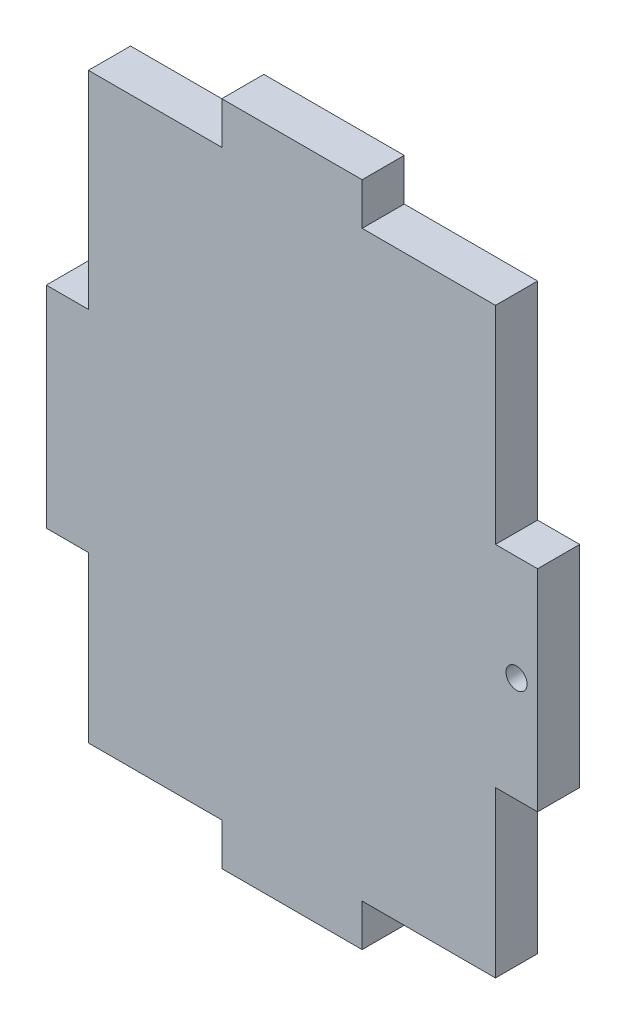
ISO-10303-21;
HEADER;
FILE_DESCRIPTION(('STEP AP214'),'2;1');
FILE_NAME('part.step','',(''),(''),'','','');
FILE_SCHEMA(('AUTOMOTIVE_DESIGN { 1 0 10303 214 1 1 1 1 }'));
ENDSEC;
DATA;
#1=APPLICATION_CONTEXT('core data for automotive mechanical design processes');
#2=APPLICATION_PROTOCOL_DEFINITION('international standard','automotive_design',2000,#1);
#3=PRODUCT_CONTEXT('',#1,'mechanical');
#4=PRODUCT('Part','Part','',(#3));
#5=PRODUCT_RELATED_PRODUCT_CATEGORY('part','',(#4));
#6=PRODUCT_DEFINITION_FORMATION('','',#4);
#7=PRODUCT_DEFINITION_CONTEXT('part definition',#1,'design');
#8=PRODUCT_DEFINITION('design','',#6,#7);
#9=PRODUCT_DEFINITION_SHAPE('','',#8);
#10=(LENGTH_UNIT() NAMED_UNIT(*) SI_UNIT(.MILLI.,.METRE.));
#11=(NAMED_UNIT(*) PLANE_ANGLE_UNIT() SI_UNIT($,.RADIAN.));
#12=(NAMED_UNIT(*) SI_UNIT($,.STERADIAN.) SOLID_ANGLE_UNIT());
#13=UNCERTAINTY_MEASURE_WITH_UNIT(LENGTH_MEASURE(1.E-05),#10,'distance_accuracy_value','');
#14=(GEOMETRIC_REPRESENTATION_CONTEXT(3) GLOBAL_UNCERTAINTY_ASSIGNED_CONTEXT((#13)) GLOBAL_UNIT_ASSIGNED_CONTEXT((#10,
#11,#12)) REPRESENTATION_CONTEXT('',''));
#15=CARTESIAN_POINT('',(0.,0.,0.));
#16=DIRECTION('',(0.,0.,1.));
#17=DIRECTION('',(1.,0.,0.));
#18=AXIS2_PLACEMENT_3D('',#15,#16,#17);
#19=CARTESIAN_POINT('',(-3.,44.5,6.));
#20=DIRECTION('',(0.,0.,-1.));
#21=DIRECTION('',(-1.,0.,0.));
#22=AXIS2_PLACEMENT_3D('',#19,#20,#21);
#23=CYLINDRICAL_SURFACE('',#22,1.5);
#24=CARTESIAN_POINT('',(-3.,44.5,6.));
#25=DIRECTION('',(0.,0.,-1.));
#26=DIRECTION('',(-1.,0.,0.));
#27=AXIS2_PLACEMENT_3D('',#24,#25,#26);
#28=CIRCLE('',#27,1.5);
#29=CARTESIAN_POINT('',(-4.5,44.5,6.));
#30=VERTEX_POINT('',#29);
#31=EDGE_CURVE('E343',#30,#30,#28,.T.);
#32=ORIENTED_EDGE('',*,*,#31,.F.);
#33=EDGE_LOOP('',(#32));
#34=FACE_BOUND('',#33,.T.);
#35=CARTESIAN_POINT('',(-3.,44.5,3.));
#36=DIRECTION('',(0.,0.,-1.));
#37=DIRECTION('',(-1.,0.,0.));
#38=AXIS2_PLACEMENT_3D('',#35,#36,#37);
#39=CIRCLE('',#38,1.5);
#40=CARTESIAN_POINT('',(-4.5,44.5,3.));
#41=VERTEX_POINT('',#40);
#42=EDGE_CURVE('E37',#41,#41,#39,.F.);
#43=ORIENTED_EDGE('',*,*,#42,.F.);
#44=EDGE_LOOP('',(#43));
#45=FACE_BOUND('',#44,.T.);
#46=ADVANCED_FACE('F33',(#34,#45),#23,.F.);
#47=CARTESIAN_POINT('',(0.,0.,6.));
#48=DIRECTION('',(-1.,0.,0.));
#49=DIRECTION('',(0.,0.,1.));
#50=AXIS2_PLACEMENT_3D('',#47,#48,#49);
#51=PLANE('',#50);
#52=DIRECTION('',(0.,1.,0.));
#53=VECTOR('',#52,1.);
#54=CARTESIAN_POINT('',(0.,0.,6.));
#55=LINE('',#54,#53);
#56=CARTESIAN_POINT('',(0.,29.5,6.));
#57=VERTEX_POINT('',#56);
#58=CARTESIAN_POINT('',(0.,59.5,6.));
#59=VERTEX_POINT('',#58);
#60=EDGE_CURVE('E296',#57,#59,#55,.T.);
#61=ORIENTED_EDGE('',*,*,#60,.F.);
#62=DIRECTION('',(0.,0.,-1.));
#63=VECTOR('',#62,1.);
#64=CARTESIAN_POINT('',(0.,29.5,6.));
#65=LINE('',#64,#63);
#66=CARTESIAN_POINT('',(0.,29.5,0.));
#67=VERTEX_POINT('',#66);
#68=EDGE_CURVE('E210',#57,#67,#65,.T.);
#69=ORIENTED_EDGE('',*,*,#68,.T.);
#70=DIRECTION('',(0.,1.,0.));
#71=VECTOR('',#70,1.);
#72=CARTESIAN_POINT('',(0.,0.,0.));
#73=LINE('',#72,#71);
#74=CARTESIAN_POINT('',(0.,59.5,0.));
#75=VERTEX_POINT('',#74);
#76=EDGE_CURVE('E287',#67,#75,#73,.T.);
#77=ORIENTED_EDGE('',*,*,#76,.T.);
#78=DIRECTION('',(0.,0.,-1.));
#79=VECTOR('',#78,1.);
#80=CARTESIAN_POINT('',(0.,59.5,6.));
#81=LINE('',#80,#79);
#82=EDGE_CURVE('E274',#59,#75,#81,.T.);
#83=ORIENTED_EDGE('',*,*,#82,.F.);
#84=EDGE_LOOP('',(#61,#69,#77,#83));
#85=FACE_BOUND('',#84,.T.);
#86=ADVANCED_FACE('F35',(#85),#51,.F.);
#87=CARTESIAN_POINT('',(0.,95.,6.));
#88=DIRECTION('',(0.,-1.,0.));
#89=DIRECTION('',(1.,0.,0.));
#90=AXIS2_PLACEMENT_3D('',#87,#88,#89);
#91=PLANE('',#90);
#92=DIRECTION('',(-1.,0.,0.));
#93=VECTOR('',#92,1.);
#94=CARTESIAN_POINT('',(0.,95.,0.));
#95=LINE('',#94,#93);
#96=CARTESIAN_POINT('',(-25.,95.,0.));
#97=VERTEX_POINT('',#96);
#98=CARTESIAN_POINT('',(-45.,95.,0.));
#99=VERTEX_POINT('',#98);
#100=EDGE_CURVE('E304',#97,#99,#95,.T.);
#101=ORIENTED_EDGE('',*,*,#100,.T.);
#102=DIRECTION('',(0.,0.,-1.));
#103=VECTOR('',#102,1.);
#104=CARTESIAN_POINT('',(-45.,95.,6.));
#105=LINE('',#104,#103);
#106=CARTESIAN_POINT('',(-45.,95.,6.));
#107=VERTEX_POINT('',#106);
#108=EDGE_CURVE('E240',#107,#99,#105,.T.);
#109=ORIENTED_EDGE('',*,*,#108,.F.);
#110=DIRECTION('',(-1.,0.,0.));
#111=VECTOR('',#110,1.);
#112=CARTESIAN_POINT('',(0.,95.,6.));
#113=LINE('',#112,#111);
#114=CARTESIAN_POINT('',(-25.,95.,6.));
#115=VERTEX_POINT('',#114);
#116=EDGE_CURVE('E298',#115,#107,#113,.T.);
#117=ORIENTED_EDGE('',*,*,#116,.F.);
#118=DIRECTION('',(0.,0.,-1.));
#119=VECTOR('',#118,1.);
#120=CARTESIAN_POINT('',(-25.,95.,6.));
#121=LINE('',#120,#119);
#122=EDGE_CURVE('E284',#115,#97,#121,.T.);
#123=ORIENTED_EDGE('',*,*,#122,.T.);
#124=EDGE_LOOP('',(#101,#109,#117,#123));
#125=FACE_BOUND('',#124,.T.);
#126=ADVANCED_FACE('F371',(#125),#91,.F.);
#127=CARTESIAN_POINT('',(-70.,0.,6.));
#128=DIRECTION('',(1.,0.,0.));
#129=DIRECTION('',(0.,0.,-1.));
#130=AXIS2_PLACEMENT_3D('',#127,#128,#129);
#131=PLANE('',#130);
#132=DIRECTION('',(0.,-1.,0.));
#133=VECTOR('',#132,1.);
#134=CARTESIAN_POINT('',(-70.,0.,0.));
#135=LINE('',#134,#133);
#136=CARTESIAN_POINT('',(-70.,59.5,0.));
#137=VERTEX_POINT('',#136);
#138=CARTESIAN_POINT('',(-70.,29.5,0.));
#139=VERTEX_POINT('',#138);
#140=EDGE_CURVE('E307',#137,#139,#135,.T.);
#141=ORIENTED_EDGE('',*,*,#140,.T.);
#142=DIRECTION('',(0.,0.,-1.));
#143=VECTOR('',#142,1.);
#144=CARTESIAN_POINT('',(-70.,29.5,6.));
#145=LINE('',#144,#143);
#146=CARTESIAN_POINT('',(-70.,29.5,6.));
#147=VERTEX_POINT('',#146);
#148=EDGE_CURVE('E58',#147,#139,#145,.T.);
#149=ORIENTED_EDGE('',*,*,#148,.F.);
#150=DIRECTION('',(0.,-1.,0.));
#151=VECTOR('',#150,1.);
#152=CARTESIAN_POINT('',(-70.,0.,6.));
#153=LINE('',#152,#151);
#154=CARTESIAN_POINT('',(-70.,59.5,6.));
#155=VERTEX_POINT('',#154);
#156=EDGE_CURVE('E42',#155,#147,#153,.T.);
#157=ORIENTED_EDGE('',*,*,#156,.F.);
#158=DIRECTION('',(0.,0.,-1.));
#159=VECTOR('',#158,1.);
#160=CARTESIAN_POINT('',(-70.,59.5,6.));
#161=LINE('',#160,#159);
#162=EDGE_CURVE('E250',#155,#137,#161,.T.);
#163=ORIENTED_EDGE('',*,*,#162,.T.);
#164=EDGE_LOOP('',(#141,#149,#157,#163));
#165=FACE_BOUND('',#164,.T.);
#166=ADVANCED_FACE('F311',(#165),#131,.F.);
#167=CARTESIAN_POINT('',(0.,0.,6.));
#168=DIRECTION('',(0.,1.,0.));
#169=DIRECTION('',(-1.,0.,0.));
#170=AXIS2_PLACEMENT_3D('',#167,#168,#169);
#171=PLANE('',#170);
#172=DIRECTION('',(1.,0.,0.));
#173=VECTOR('',#172,1.);
#174=CARTESIAN_POINT('',(0.,0.,0.));
#175=LINE('',#174,#173);
#176=CARTESIAN_POINT('',(-45.,0.,0.));
#177=VERTEX_POINT('',#176);
#178=CARTESIAN_POINT('',(-25.,0.,0.));
#179=VERTEX_POINT('',#178);
#180=EDGE_CURVE('E187',#177,#179,#175,.T.);
#181=ORIENTED_EDGE('',*,*,#180,.T.);
#182=DIRECTION('',(0.,0.,-1.));
#183=VECTOR('',#182,1.);
#184=CARTESIAN_POINT('',(-25.,0.,6.));
#185=LINE('',#184,#183);
#186=CARTESIAN_POINT('',(-25.,0.,6.));
#187=VERTEX_POINT('',#186);
#188=EDGE_CURVE('E50',#187,#179,#185,.T.);
#189=ORIENTED_EDGE('',*,*,#188,.F.);
#190=DIRECTION('',(1.,0.,0.));
#191=VECTOR('',#190,1.);
#192=CARTESIAN_POINT('',(0.,0.,6.));
#193=LINE('',#192,#191);
#194=CARTESIAN_POINT('',(-45.,0.,6.));
#195=VERTEX_POINT('',#194);
#196=EDGE_CURVE('E11',#195,#187,#193,.T.);
#197=ORIENTED_EDGE('',*,*,#196,.F.);
#198=DIRECTION('',(0.,0.,-1.));
#199=VECTOR('',#198,1.);
#200=CARTESIAN_POINT('',(-45.,0.,6.));
#201=LINE('',#200,#199);
#202=EDGE_CURVE('E219',#195,#177,#201,.T.);
#203=ORIENTED_EDGE('',*,*,#202,.T.);
#204=EDGE_LOOP('',(#181,#189,#197,#203));
#205=FACE_BOUND('',#204,.T.);
#206=ADVANCED_FACE('F184',(#205),#171,.F.);
#207=CARTESIAN_POINT('',(0.,0.,6.));
#208=DIRECTION('',(0.,0.,1.));
#209=DIRECTION('',(1.,0.,0.));
#210=AXIS2_PLACEMENT_3D('',#207,#208,#209);
#211=PLANE('',#210);
#212=ORIENTED_EDGE('',*,*,#31,.T.);
#213=EDGE_LOOP('',(#212));
#214=FACE_BOUND('',#213,.T.);
#215=DIRECTION('',(1.,0.,0.));
#216=VECTOR('',#215,1.);
#217=CARTESIAN_POINT('',(0.,29.5,6.));
#218=LINE('',#217,#216);
#219=CARTESIAN_POINT('',(-6.,29.5,6.));
#220=VERTEX_POINT('',#219);
#221=EDGE_CURVE('E188',#220,#57,#218,.T.);
#222=ORIENTED_EDGE('',*,*,#221,.T.);
#223=ORIENTED_EDGE('',*,*,#60,.T.);
#224=DIRECTION('',(-1.,0.,0.));
#225=VECTOR('',#224,1.);
#226=CARTESIAN_POINT('',(0.,59.5,6.));
#227=LINE('',#226,#225);
#228=CARTESIAN_POINT('',(-6.,59.5,6.));
#229=VERTEX_POINT('',#228);
#230=EDGE_CURVE('E261',#59,#229,#227,.T.);
#231=ORIENTED_EDGE('',*,*,#230,.T.);
#232=DIRECTION('',(0.,1.,0.));
#233=VECTOR('',#232,1.);
#234=CARTESIAN_POINT('',(-6.,89.,6.));
#235=LINE('',#234,#233);
#236=CARTESIAN_POINT('',(-6.,89.,6.));
#237=VERTEX_POINT('',#236);
#238=EDGE_CURVE('E264',#229,#237,#235,.T.);
#239=ORIENTED_EDGE('',*,*,#238,.T.);
#240=DIRECTION('',(-1.,0.,0.));
#241=VECTOR('',#240,1.);
#242=CARTESIAN_POINT('',(-6.,89.,6.));
#243=LINE('',#242,#241);
#244=CARTESIAN_POINT('',(-25.,89.,6.));
#245=VERTEX_POINT('',#244);
#246=EDGE_CURVE('E268',#237,#245,#243,.T.);
#247=ORIENTED_EDGE('',*,*,#246,.T.);
#248=DIRECTION('',(0.,1.,0.));
#249=VECTOR('',#248,1.);
#250=CARTESIAN_POINT('',(-25.,95.,6.));
#251=LINE('',#250,#249);
#252=EDGE_CURVE('E271',#245,#115,#251,.T.);
#253=ORIENTED_EDGE('',*,*,#252,.T.);
#254=ORIENTED_EDGE('',*,*,#116,.T.);
#255=DIRECTION('',(0.,-1.,0.));
#256=VECTOR('',#255,1.);
#257=CARTESIAN_POINT('',(-45.,95.,6.));
#258=LINE('',#257,#256);
#259=CARTESIAN_POINT('',(-45.,89.,6.));
#260=VERTEX_POINT('',#259);
#261=EDGE_CURVE('E227',#107,#260,#258,.T.);
#262=ORIENTED_EDGE('',*,*,#261,.T.);
#263=DIRECTION('',(-1.,0.,0.));
#264=VECTOR('',#263,1.);
#265=CARTESIAN_POINT('',(-64.,89.,6.));
#266=LINE('',#265,#264);
#267=CARTESIAN_POINT('',(-64.,89.,6.));
#268=VERTEX_POINT('',#267);
#269=EDGE_CURVE('E230',#260,#268,#266,.T.);
#270=ORIENTED_EDGE('',*,*,#269,.T.);
#271=DIRECTION('',(0.,-1.,0.));
#272=VECTOR('',#271,1.);
#273=CARTESIAN_POINT('',(-64.,89.,6.));
#274=LINE('',#273,#272);
#275=CARTESIAN_POINT('',(-64.,59.5,6.));
#276=VERTEX_POINT('',#275);
#277=EDGE_CURVE('E234',#268,#276,#274,.T.);
#278=ORIENTED_EDGE('',*,*,#277,.T.);
#279=DIRECTION('',(-1.,0.,0.));
#280=VECTOR('',#279,1.);
#281=CARTESIAN_POINT('',(-70.,59.5,6.));
#282=LINE('',#281,#280);
#283=EDGE_CURVE('E237',#276,#155,#282,.T.);
#284=ORIENTED_EDGE('',*,*,#283,.T.);
#285=ORIENTED_EDGE('',*,*,#156,.T.);
#286=DIRECTION('',(1.,0.,0.));
#287=VECTOR('',#286,1.);
#288=CARTESIAN_POINT('',(-70.,29.5,6.));
#289=LINE('',#288,#287);
#290=CARTESIAN_POINT('',(-64.,29.5,6.));
#291=VERTEX_POINT('',#290);
#292=EDGE_CURVE('E218',#147,#291,#289,.T.);
#293=ORIENTED_EDGE('',*,*,#292,.T.);
#294=DIRECTION('',(0.,-1.,0.));
#295=VECTOR('',#294,1.);
#296=CARTESIAN_POINT('',(-64.,6.,6.));
#297=LINE('',#296,#295);
#298=CARTESIAN_POINT('',(-64.,6.,6.));
#299=VERTEX_POINT('',#298);
#300=EDGE_CURVE('E203',#291,#299,#297,.T.);
#301=ORIENTED_EDGE('',*,*,#300,.T.);
#302=DIRECTION('',(1.,0.,0.));
#303=VECTOR('',#302,1.);
#304=CARTESIAN_POINT('',(-64.,6.,6.));
#305=LINE('',#304,#303);
#306=CARTESIAN_POINT('',(-45.,6.,6.));
#307=VERTEX_POINT('',#306);
#308=EDGE_CURVE('E198',#299,#307,#305,.T.);
#309=ORIENTED_EDGE('',*,*,#308,.T.);
#310=DIRECTION('',(0.,-1.,0.));
#311=VECTOR('',#310,1.);
#312=CARTESIAN_POINT('',(-45.,0.,6.));
#313=LINE('',#312,#311);
#314=EDGE_CURVE('E195',#307,#195,#313,.T.);
#315=ORIENTED_EDGE('',*,*,#314,.T.);
#316=ORIENTED_EDGE('',*,*,#196,.T.);
#317=DIRECTION('',(0.,1.,0.));
#318=VECTOR('',#317,1.);
#319=CARTESIAN_POINT('',(-25.,0.,6.));
#320=LINE('',#319,#318);
#321=CARTESIAN_POINT('',(-25.,6.,6.));
#322=VERTEX_POINT('',#321);
#323=EDGE_CURVE('E172',#187,#322,#320,.T.);
#324=ORIENTED_EDGE('',*,*,#323,.T.);
#325=DIRECTION('',(1.,0.,0.));
#326=VECTOR('',#325,1.);
#327=CARTESIAN_POINT('',(-6.,6.,6.));
#328=LINE('',#327,#326);
#329=CARTESIAN_POINT('',(-6.,6.,6.));
#330=VERTEX_POINT('',#329);
#331=EDGE_CURVE('E178',#322,#330,#328,.T.);
#332=ORIENTED_EDGE('',*,*,#331,.T.);
#333=DIRECTION('',(0.,1.,0.));
#334=VECTOR('',#333,1.);
#335=CARTESIAN_POINT('',(-6.,6.,6.));
#336=LINE('',#335,#334);
#337=EDGE_CURVE('E345',#330,#220,#336,.T.);
#338=ORIENTED_EDGE('',*,*,#337,.T.);
#339=EDGE_LOOP('',(#222,#223,#231,#239,#247,#253,#254,#262,#270,#278,#284,#285,#293,#301,#309,
#315,#316,#324,#332,#338));
#340=FACE_BOUND('',#339,.T.);
#341=ADVANCED_FACE('F192',(#214,#340),#211,.T.);
#342=CARTESIAN_POINT('',(0.,0.,0.));
#343=DIRECTION('',(0.,0.,1.));
#344=DIRECTION('',(1.,0.,0.));
#345=AXIS2_PLACEMENT_3D('',#342,#343,#344);
#346=PLANE('',#345);
#347=CARTESIAN_POINT('',(-3.,44.5,0.));
#348=DIRECTION('',(0.,0.,-1.));
#349=DIRECTION('',(-1.,0.,0.));
#350=AXIS2_PLACEMENT_3D('',#347,#348,#349);
#351=CIRCLE('',#350,2.995);
#352=CARTESIAN_POINT('',(-5.995,44.5,0.));
#353=VERTEX_POINT('',#352);
#354=EDGE_CURVE('E351',#353,#353,#351,.T.);
#355=ORIENTED_EDGE('',*,*,#354,.F.);
#356=EDGE_LOOP('',(#355));
#357=FACE_BOUND('',#356,.T.);
#358=ORIENTED_EDGE('',*,*,#76,.F.);
#359=DIRECTION('',(1.,0.,0.));
#360=VECTOR('',#359,1.);
#361=CARTESIAN_POINT('',(0.,29.5,0.));
#362=LINE('',#361,#360);
#363=CARTESIAN_POINT('',(-6.,29.5,0.));
#364=VERTEX_POINT('',#363);
#365=EDGE_CURVE('E179',#364,#67,#362,.T.);
#366=ORIENTED_EDGE('',*,*,#365,.F.);
#367=DIRECTION('',(0.,1.,0.));
#368=VECTOR('',#367,1.);
#369=CARTESIAN_POINT('',(-6.,6.,0.));
#370=LINE('',#369,#368);
#371=CARTESIAN_POINT('',(-6.,6.,0.));
#372=VERTEX_POINT('',#371);
#373=EDGE_CURVE('E335',#372,#364,#370,.T.);
#374=ORIENTED_EDGE('',*,*,#373,.F.);
#375=DIRECTION('',(1.,0.,0.));
#376=VECTOR('',#375,1.);
#377=CARTESIAN_POINT('',(-6.,6.,0.));
#378=LINE('',#377,#376);
#379=CARTESIAN_POINT('',(-25.,6.,0.));
#380=VERTEX_POINT('',#379);
#381=EDGE_CURVE('E338',#380,#372,#378,.T.);
#382=ORIENTED_EDGE('',*,*,#381,.F.);
#383=DIRECTION('',(0.,1.,0.));
#384=VECTOR('',#383,1.);
#385=CARTESIAN_POINT('',(-25.,0.,0.));
#386=LINE('',#385,#384);
#387=EDGE_CURVE('E341',#179,#380,#386,.T.);
#388=ORIENTED_EDGE('',*,*,#387,.F.);
#389=ORIENTED_EDGE('',*,*,#180,.F.);
#390=DIRECTION('',(0.,-1.,0.));
#391=VECTOR('',#390,1.);
#392=CARTESIAN_POINT('',(-45.,0.,0.));
#393=LINE('',#392,#391);
#394=CARTESIAN_POINT('',(-45.,6.,0.));
#395=VERTEX_POINT('',#394);
#396=EDGE_CURVE('E216',#395,#177,#393,.T.);
#397=ORIENTED_EDGE('',*,*,#396,.F.);
#398=DIRECTION('',(1.,0.,0.));
#399=VECTOR('',#398,1.);
#400=CARTESIAN_POINT('',(-64.,6.,0.));
#401=LINE('',#400,#399);
#402=CARTESIAN_POINT('',(-64.,6.,0.));
#403=VERTEX_POINT('',#402);
#404=EDGE_CURVE('E213',#403,#395,#401,.T.);
#405=ORIENTED_EDGE('',*,*,#404,.F.);
#406=DIRECTION('',(0.,-1.,0.));
#407=VECTOR('',#406,1.);
#408=CARTESIAN_POINT('',(-64.,6.,0.));
#409=LINE('',#408,#407);
#410=CARTESIAN_POINT('',(-64.,29.5,0.));
#411=VERTEX_POINT('',#410);
#412=EDGE_CURVE('E209',#411,#403,#409,.T.);
#413=ORIENTED_EDGE('',*,*,#412,.F.);
#414=DIRECTION('',(1.,0.,0.));
#415=VECTOR('',#414,1.);
#416=CARTESIAN_POINT('',(-70.,29.5,0.));
#417=LINE('',#416,#415);
#418=EDGE_CURVE('E207',#139,#411,#417,.T.);
#419=ORIENTED_EDGE('',*,*,#418,.F.);
#420=ORIENTED_EDGE('',*,*,#140,.F.);
#421=DIRECTION('',(-1.,0.,0.));
#422=VECTOR('',#421,1.);
#423=CARTESIAN_POINT('',(-70.,59.5,0.));
#424=LINE('',#423,#422);
#425=CARTESIAN_POINT('',(-64.,59.5,0.));
#426=VERTEX_POINT('',#425);
#427=EDGE_CURVE('E231',#426,#137,#424,.T.);
#428=ORIENTED_EDGE('',*,*,#427,.F.);
#429=DIRECTION('',(0.,-1.,0.));
#430=VECTOR('',#429,1.);
#431=CARTESIAN_POINT('',(-64.,89.,0.));
#432=LINE('',#431,#430);
#433=CARTESIAN_POINT('',(-64.,89.,0.));
#434=VERTEX_POINT('',#433);
#435=EDGE_CURVE('E246',#434,#426,#432,.T.);
#436=ORIENTED_EDGE('',*,*,#435,.F.);
#437=DIRECTION('',(-1.,0.,0.));
#438=VECTOR('',#437,1.);
#439=CARTESIAN_POINT('',(-64.,89.,0.));
#440=LINE('',#439,#438);
#441=CARTESIAN_POINT('',(-45.,89.,0.));
#442=VERTEX_POINT('',#441);
#443=EDGE_CURVE('E243',#442,#434,#440,.T.);
#444=ORIENTED_EDGE('',*,*,#443,.F.);
#445=DIRECTION('',(0.,-1.,0.));
#446=VECTOR('',#445,1.);
#447=CARTESIAN_POINT('',(-45.,95.,0.));
#448=LINE('',#447,#446);
#449=EDGE_CURVE('E221',#99,#442,#448,.T.);
#450=ORIENTED_EDGE('',*,*,#449,.F.);
#451=ORIENTED_EDGE('',*,*,#100,.F.);
#452=DIRECTION('',(0.,1.,0.));
#453=VECTOR('',#452,1.);
#454=CARTESIAN_POINT('',(-25.,95.,0.));
#455=LINE('',#454,#453);
#456=CARTESIAN_POINT('',(-25.,89.,0.));
#457=VERTEX_POINT('',#456);
#458=EDGE_CURVE('E265',#457,#97,#455,.T.);
#459=ORIENTED_EDGE('',*,*,#458,.F.);
#460=DIRECTION('',(-1.,0.,0.));
#461=VECTOR('',#460,1.);
#462=CARTESIAN_POINT('',(-6.,89.,0.));
#463=LINE('',#462,#461);
#464=CARTESIAN_POINT('',(-6.,89.,0.));
#465=VERTEX_POINT('',#464);
#466=EDGE_CURVE('E280',#465,#457,#463,.T.);
#467=ORIENTED_EDGE('',*,*,#466,.F.);
#468=DIRECTION('',(0.,1.,0.));
#469=VECTOR('',#468,1.);
#470=CARTESIAN_POINT('',(-6.,89.,0.));
#471=LINE('',#470,#469);
#472=CARTESIAN_POINT('',(-6.,59.5,0.));
#473=VERTEX_POINT('',#472);
#474=EDGE_CURVE('E277',#473,#465,#471,.T.);
#475=ORIENTED_EDGE('',*,*,#474,.F.);
#476=DIRECTION('',(-1.,0.,0.));
#477=VECTOR('',#476,1.);
#478=CARTESIAN_POINT('',(0.,59.5,0.));
#479=LINE('',#478,#477);
#480=EDGE_CURVE('E253',#75,#473,#479,.T.);
#481=ORIENTED_EDGE('',*,*,#480,.F.);
#482=EDGE_LOOP('',(#358,#366,#374,#382,#388,#389,#397,#405,#413,#419,#420,#428,#436,#444,#450,
#451,#459,#467,#475,#481));
#483=FACE_BOUND('',#482,.T.);
#484=ADVANCED_FACE('F316',(#357,#483),#346,.F.);
#485=CARTESIAN_POINT('',(-25.,95.,6.));
#486=DIRECTION('',(-1.,0.,0.));
#487=DIRECTION('',(0.,0.,1.));
#488=AXIS2_PLACEMENT_3D('',#485,#486,#487);
#489=PLANE('',#488);
#490=ORIENTED_EDGE('',*,*,#458,.T.);
#491=ORIENTED_EDGE('',*,*,#122,.F.);
#492=ORIENTED_EDGE('',*,*,#252,.F.);
#493=DIRECTION('',(0.,0.,-1.));
#494=VECTOR('',#493,1.);
#495=CARTESIAN_POINT('',(-25.,89.,6.));
#496=LINE('',#495,#494);
#497=EDGE_CURVE('E288',#245,#457,#496,.T.);
#498=ORIENTED_EDGE('',*,*,#497,.T.);
#499=EDGE_LOOP('',(#490,#491,#492,#498));
#500=FACE_BOUND('',#499,.T.);
#501=ADVANCED_FACE('F419',(#500),#489,.F.);
#502=CARTESIAN_POINT('',(-6.,89.,6.));
#503=DIRECTION('',(0.,-1.,0.));
#504=DIRECTION('',(0.,0.,-1.));
#505=AXIS2_PLACEMENT_3D('',#502,#503,#504);
#506=PLANE('',#505);
#507=ORIENTED_EDGE('',*,*,#466,.T.);
#508=ORIENTED_EDGE('',*,*,#497,.F.);
#509=ORIENTED_EDGE('',*,*,#246,.F.);
#510=DIRECTION('',(0.,0.,-1.));
#511=VECTOR('',#510,1.);
#512=CARTESIAN_POINT('',(-6.,89.,6.));
#513=LINE('',#512,#511);
#514=EDGE_CURVE('E290',#237,#465,#513,.T.);
#515=ORIENTED_EDGE('',*,*,#514,.T.);
#516=EDGE_LOOP('',(#507,#508,#509,#515));
#517=FACE_BOUND('',#516,.T.);
#518=ADVANCED_FACE('F422',(#517),#506,.F.);
#519=CARTESIAN_POINT('',(-6.,89.,6.));
#520=DIRECTION('',(-1.,0.,0.));
#521=DIRECTION('',(0.,-1.,0.));
#522=AXIS2_PLACEMENT_3D('',#519,#520,#521);
#523=PLANE('',#522);
#524=ORIENTED_EDGE('',*,*,#474,.T.);
#525=ORIENTED_EDGE('',*,*,#514,.F.);
#526=ORIENTED_EDGE('',*,*,#238,.F.);
#527=DIRECTION('',(0.,0.,-1.));
#528=VECTOR('',#527,1.);
#529=CARTESIAN_POINT('',(-6.,59.5,6.));
#530=LINE('',#529,#528);
#531=EDGE_CURVE('E292',#229,#473,#530,.T.);
#532=ORIENTED_EDGE('',*,*,#531,.T.);
#533=EDGE_LOOP('',(#524,#525,#526,#532));
#534=FACE_BOUND('',#533,.T.);
#535=ADVANCED_FACE('F426',(#534),#523,.F.);
#536=CARTESIAN_POINT('',(0.,59.5,6.));
#537=DIRECTION('',(0.,-1.,0.));
#538=DIRECTION('',(0.,0.,-1.));
#539=AXIS2_PLACEMENT_3D('',#536,#537,#538);
#540=PLANE('',#539);
#541=ORIENTED_EDGE('',*,*,#480,.T.);
#542=ORIENTED_EDGE('',*,*,#531,.F.);
#543=ORIENTED_EDGE('',*,*,#230,.F.);
#544=ORIENTED_EDGE('',*,*,#82,.T.);
#545=EDGE_LOOP('',(#541,#542,#543,#544));
#546=FACE_BOUND('',#545,.T.);
#547=ADVANCED_FACE('F407',(#546),#540,.F.);
#548=CARTESIAN_POINT('',(-70.,59.5,6.));
#549=DIRECTION('',(0.,-1.,0.));
#550=DIRECTION('',(1.,0.,0.));
#551=AXIS2_PLACEMENT_3D('',#548,#549,#550);
#552=PLANE('',#551);
#553=ORIENTED_EDGE('',*,*,#427,.T.);
#554=ORIENTED_EDGE('',*,*,#162,.F.);
#555=ORIENTED_EDGE('',*,*,#283,.F.);
#556=DIRECTION('',(0.,0.,-1.));
#557=VECTOR('',#556,1.);
#558=CARTESIAN_POINT('',(-64.,59.5,6.));
#559=LINE('',#558,#557);
#560=EDGE_CURVE('E254',#276,#426,#559,.T.);
#561=ORIENTED_EDGE('',*,*,#560,.T.);
#562=EDGE_LOOP('',(#553,#554,#555,#561));
#563=FACE_BOUND('',#562,.T.);
#564=ADVANCED_FACE('F403',(#563),#552,.F.);
#565=CARTESIAN_POINT('',(-64.,89.,6.));
#566=DIRECTION('',(1.,0.,0.));
#567=DIRECTION('',(0.,0.,-1.));
#568=AXIS2_PLACEMENT_3D('',#565,#566,#567);
#569=PLANE('',#568);
#570=ORIENTED_EDGE('',*,*,#435,.T.);
#571=ORIENTED_EDGE('',*,*,#560,.F.);
#572=ORIENTED_EDGE('',*,*,#277,.F.);
#573=DIRECTION('',(0.,0.,-1.));
#574=VECTOR('',#573,1.);
#575=CARTESIAN_POINT('',(-64.,89.,6.));
#576=LINE('',#575,#574);
#577=EDGE_CURVE('E256',#268,#434,#576,.T.);
#578=ORIENTED_EDGE('',*,*,#577,.T.);
#579=EDGE_LOOP('',(#570,#571,#572,#578));
#580=FACE_BOUND('',#579,.T.);
#581=ADVANCED_FACE('F406',(#580),#569,.F.);
#582=CARTESIAN_POINT('',(-64.,89.,6.));
#583=DIRECTION('',(0.,-1.,0.));
#584=DIRECTION('',(1.,0.,0.));
#585=AXIS2_PLACEMENT_3D('',#582,#583,#584);
#586=PLANE('',#585);
#587=ORIENTED_EDGE('',*,*,#443,.T.);
#588=ORIENTED_EDGE('',*,*,#577,.F.);
#589=ORIENTED_EDGE('',*,*,#269,.F.);
#590=DIRECTION('',(0.,0.,-1.));
#591=VECTOR('',#590,1.);
#592=CARTESIAN_POINT('',(-45.,89.,6.));
#593=LINE('',#592,#591);
#594=EDGE_CURVE('E258',#260,#442,#593,.T.);
#595=ORIENTED_EDGE('',*,*,#594,.T.);
#596=EDGE_LOOP('',(#587,#588,#589,#595));
#597=FACE_BOUND('',#596,.T.);
#598=ADVANCED_FACE('F411',(#597),#586,.F.);
#599=CARTESIAN_POINT('',(-45.,95.,6.));
#600=DIRECTION('',(1.,0.,0.));
#601=DIRECTION('',(0.,0.,-1.));
#602=AXIS2_PLACEMENT_3D('',#599,#600,#601);
#603=PLANE('',#602);
#604=ORIENTED_EDGE('',*,*,#449,.T.);
#605=ORIENTED_EDGE('',*,*,#594,.F.);
#606=ORIENTED_EDGE('',*,*,#261,.F.);
#607=ORIENTED_EDGE('',*,*,#108,.T.);
#608=EDGE_LOOP('',(#604,#605,#606,#607));
#609=FACE_BOUND('',#608,.T.);
#610=ADVANCED_FACE('F395',(#609),#603,.F.);
#611=CARTESIAN_POINT('',(-45.,0.,6.));
#612=DIRECTION('',(1.,0.,0.));
#613=DIRECTION('',(0.,0.,-1.));
#614=AXIS2_PLACEMENT_3D('',#611,#612,#613);
#615=PLANE('',#614);
#616=ORIENTED_EDGE('',*,*,#396,.T.);
#617=ORIENTED_EDGE('',*,*,#202,.F.);
#618=ORIENTED_EDGE('',*,*,#314,.F.);
#619=DIRECTION('',(0.,0.,-1.));
#620=VECTOR('',#619,1.);
#621=CARTESIAN_POINT('',(-45.,6.,6.));
#622=LINE('',#621,#620);
#623=EDGE_CURVE('E222',#307,#395,#622,.T.);
#624=ORIENTED_EDGE('',*,*,#623,.T.);
#625=EDGE_LOOP('',(#616,#617,#618,#624));
#626=FACE_BOUND('',#625,.T.);
#627=ADVANCED_FACE('F391',(#626),#615,.F.);
#628=CARTESIAN_POINT('',(-64.,6.,6.));
#629=DIRECTION('',(0.,1.,0.));
#630=DIRECTION('',(-1.,0.,0.));
#631=AXIS2_PLACEMENT_3D('',#628,#629,#630);
#632=PLANE('',#631);
#633=ORIENTED_EDGE('',*,*,#404,.T.);
#634=ORIENTED_EDGE('',*,*,#623,.F.);
#635=ORIENTED_EDGE('',*,*,#308,.F.);
#636=DIRECTION('',(0.,0.,-1.));
#637=VECTOR('',#636,1.);
#638=CARTESIAN_POINT('',(-64.,6.,6.));
#639=LINE('',#638,#637);
#640=EDGE_CURVE('E224',#299,#403,#639,.T.);
#641=ORIENTED_EDGE('',*,*,#640,.T.);
#642=EDGE_LOOP('',(#633,#634,#635,#641));
#643=FACE_BOUND('',#642,.T.);
#644=ADVANCED_FACE('F394',(#643),#632,.F.);
#645=CARTESIAN_POINT('',(-64.,6.,6.));
#646=DIRECTION('',(1.,0.,0.));
#647=DIRECTION('',(0.,0.,-1.));
#648=AXIS2_PLACEMENT_3D('',#645,#646,#647);
#649=PLANE('',#648);
#650=ORIENTED_EDGE('',*,*,#412,.T.);
#651=ORIENTED_EDGE('',*,*,#640,.F.);
#652=ORIENTED_EDGE('',*,*,#300,.F.);
#653=DIRECTION('',(0.,0.,-1.));
#654=VECTOR('',#653,1.);
#655=CARTESIAN_POINT('',(-64.,29.5,6.));
#656=LINE('',#655,#654);
#657=EDGE_CURVE('E201',#291,#411,#656,.T.);
#658=ORIENTED_EDGE('',*,*,#657,.T.);
#659=EDGE_LOOP('',(#650,#651,#652,#658));
#660=FACE_BOUND('',#659,.T.);
#661=ADVANCED_FACE('F324',(#660),#649,.F.);
#662=CARTESIAN_POINT('',(-70.,29.5,6.));
#663=DIRECTION('',(0.,1.,0.));
#664=DIRECTION('',(0.,0.,1.));
#665=AXIS2_PLACEMENT_3D('',#662,#663,#664);
#666=PLANE('',#665);
#667=ORIENTED_EDGE('',*,*,#418,.T.);
#668=ORIENTED_EDGE('',*,*,#657,.F.);
#669=ORIENTED_EDGE('',*,*,#292,.F.);
#670=ORIENTED_EDGE('',*,*,#148,.T.);
#671=EDGE_LOOP('',(#667,#668,#669,#670));
#672=FACE_BOUND('',#671,.T.);
#673=ADVANCED_FACE('F320',(#672),#666,.F.);
#674=CARTESIAN_POINT('',(0.,29.5,6.));
#675=DIRECTION('',(0.,1.,0.));
#676=DIRECTION('',(0.,0.,1.));
#677=AXIS2_PLACEMENT_3D('',#674,#675,#676);
#678=PLANE('',#677);
#679=ORIENTED_EDGE('',*,*,#365,.T.);
#680=ORIENTED_EDGE('',*,*,#68,.F.);
#681=ORIENTED_EDGE('',*,*,#221,.F.);
#682=DIRECTION('',(0.,0.,-1.));
#683=VECTOR('',#682,1.);
#684=CARTESIAN_POINT('',(-6.,29.5,6.));
#685=LINE('',#684,#683);
#686=EDGE_CURVE('E330',#220,#364,#685,.T.);
#687=ORIENTED_EDGE('',*,*,#686,.T.);
#688=EDGE_LOOP('',(#679,#680,#681,#687));
#689=FACE_BOUND('',#688,.T.);
#690=ADVANCED_FACE('F378',(#689),#678,.F.);
#691=CARTESIAN_POINT('',(-6.,6.,6.));
#692=DIRECTION('',(-1.,0.,0.));
#693=DIRECTION('',(0.,0.,1.));
#694=AXIS2_PLACEMENT_3D('',#691,#692,#693);
#695=PLANE('',#694);
#696=ORIENTED_EDGE('',*,*,#373,.T.);
#697=ORIENTED_EDGE('',*,*,#686,.F.);
#698=ORIENTED_EDGE('',*,*,#337,.F.);
#699=DIRECTION('',(0.,0.,-1.));
#700=VECTOR('',#699,1.);
#701=CARTESIAN_POINT('',(-6.,6.,6.));
#702=LINE('',#701,#700);
#703=EDGE_CURVE('E328',#330,#372,#702,.T.);
#704=ORIENTED_EDGE('',*,*,#703,.T.);
#705=EDGE_LOOP('',(#696,#697,#698,#704));
#706=FACE_BOUND('',#705,.T.);
#707=ADVANCED_FACE('F381',(#706),#695,.F.);
#708=CARTESIAN_POINT('',(-6.,6.,6.));
#709=DIRECTION('',(0.,1.,0.));
#710=DIRECTION('',(0.,0.,1.));
#711=AXIS2_PLACEMENT_3D('',#708,#709,#710);
#712=PLANE('',#711);
#713=ORIENTED_EDGE('',*,*,#381,.T.);
#714=ORIENTED_EDGE('',*,*,#703,.F.);
#715=ORIENTED_EDGE('',*,*,#331,.F.);
#716=DIRECTION('',(0.,0.,-1.));
#717=VECTOR('',#716,1.);
#718=CARTESIAN_POINT('',(-25.,6.,6.));
#719=LINE('',#718,#717);
#720=EDGE_CURVE('E174',#322,#380,#719,.T.);
#721=ORIENTED_EDGE('',*,*,#720,.T.);
#722=EDGE_LOOP('',(#713,#714,#715,#721));
#723=FACE_BOUND('',#722,.T.);
#724=ADVANCED_FACE('F385',(#723),#712,.F.);
#725=CARTESIAN_POINT('',(-25.,0.,6.));
#726=DIRECTION('',(-1.,0.,0.));
#727=DIRECTION('',(0.,0.,1.));
#728=AXIS2_PLACEMENT_3D('',#725,#726,#727);
#729=PLANE('',#728);
#730=ORIENTED_EDGE('',*,*,#387,.T.);
#731=ORIENTED_EDGE('',*,*,#720,.F.);
#732=ORIENTED_EDGE('',*,*,#323,.F.);
#733=ORIENTED_EDGE('',*,*,#188,.T.);
#734=EDGE_LOOP('',(#730,#731,#732,#733));
#735=FACE_BOUND('',#734,.T.);
#736=ADVANCED_FACE('F173',(#735),#729,.F.);
#737=CARTESIAN_POINT('',(-3.,44.5,3.));
#738=DIRECTION('',(0.,0.,-1.));
#739=DIRECTION('',(-1.,0.,0.));
#740=AXIS2_PLACEMENT_3D('',#737,#738,#739);
#741=PLANE('',#740);
#742=CARTESIAN_POINT('',(-3.,44.5,3.));
#743=DIRECTION('',(0.,0.,-1.));
#744=DIRECTION('',(-1.,0.,0.));
#745=AXIS2_PLACEMENT_3D('',#742,#743,#744);
#746=CIRCLE('',#745,2.995);
#747=CARTESIAN_POINT('',(-5.995,44.5,3.));
#748=VERTEX_POINT('',#747);
#749=EDGE_CURVE('E354',#748,#748,#746,.T.);
#750=ORIENTED_EDGE('',*,*,#749,.T.);
#751=EDGE_LOOP('',(#750));
#752=FACE_BOUND('',#751,.T.);
#753=ORIENTED_EDGE('',*,*,#42,.T.);
#754=EDGE_LOOP('',(#753));
#755=FACE_BOUND('',#754,.T.);
#756=ADVANCED_FACE('F361',(#752,#755),#741,.T.);
#757=CARTESIAN_POINT('',(-3.,44.5,3.));
#758=DIRECTION('',(0.,0.,-1.));
#759=DIRECTION('',(-1.,0.,0.));
#760=AXIS2_PLACEMENT_3D('',#757,#758,#759);
#761=CYLINDRICAL_SURFACE('',#760,2.995);
#762=ORIENTED_EDGE('',*,*,#749,.F.);
#763=EDGE_LOOP('',(#762));
#764=FACE_BOUND('',#763,.T.);
#765=ORIENTED_EDGE('',*,*,#354,.T.);
#766=EDGE_LOOP('',(#765));
#767=FACE_BOUND('',#766,.T.);
#768=ADVANCED_FACE('F376',(#764,#767),#761,.F.);
#769=CLOSED_SHELL('',(#46,#86,#126,#166,#206,#341,#484,#501,#518,#535,#547,#564,#581,#598,#610,
#627,#644,#661,#673,#690,#707,#724,#736,#756,#768));
#770=MANIFOLD_SOLID_BREP('B2',#769);
#771=ADVANCED_BREP_SHAPE_REPRESENTATION('',(#18,#770),#14);
#772=SHAPE_DEFINITION_REPRESENTATION(#9,#771);
ENDSEC;
END-ISO-10303-21;
